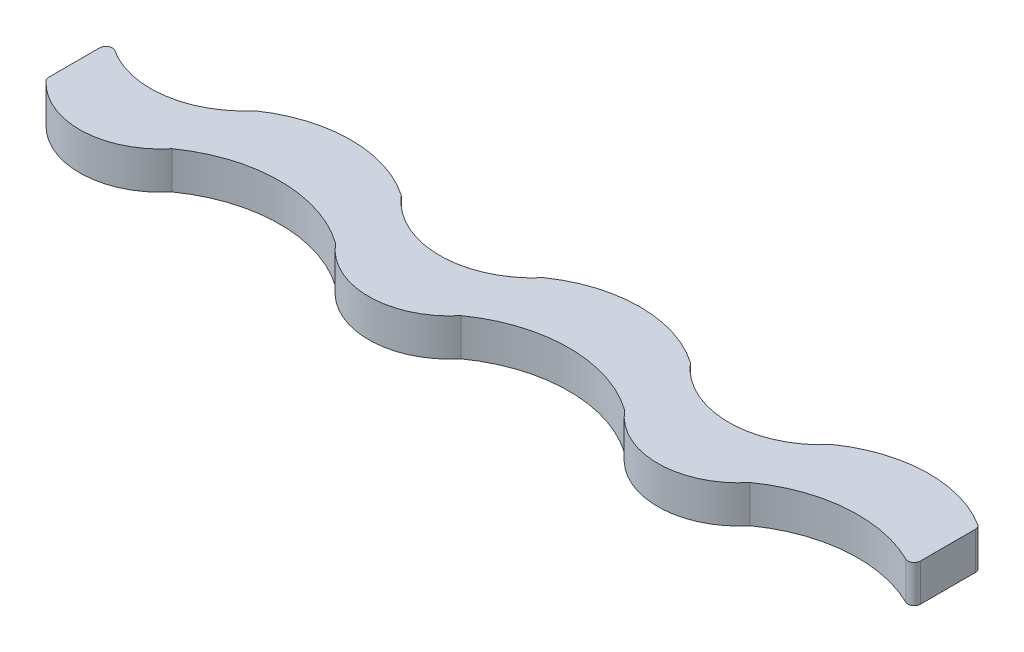
ISO-10303-21;
HEADER;
FILE_DESCRIPTION(('STEP AP214'),'2;1');
FILE_NAME('part.step','',(''),(''),'','','');
FILE_SCHEMA(('AUTOMOTIVE_DESIGN { 1 0 10303 214 1 1 1 1 }'));
ENDSEC;
DATA;
#1=APPLICATION_CONTEXT('core data for automotive mechanical design processes');
#2=APPLICATION_PROTOCOL_DEFINITION('international standard','automotive_design',2000,#1);
#3=PRODUCT_CONTEXT('',#1,'mechanical');
#4=PRODUCT('Part','Part','',(#3));
#5=PRODUCT_RELATED_PRODUCT_CATEGORY('part','',(#4));
#6=PRODUCT_DEFINITION_FORMATION('','',#4);
#7=PRODUCT_DEFINITION_CONTEXT('part definition',#1,'design');
#8=PRODUCT_DEFINITION('design','',#6,#7);
#9=PRODUCT_DEFINITION_SHAPE('','',#8);
#10=(LENGTH_UNIT() NAMED_UNIT(*) SI_UNIT(.MILLI.,.METRE.));
#11=(NAMED_UNIT(*) PLANE_ANGLE_UNIT() SI_UNIT($,.RADIAN.));
#12=(NAMED_UNIT(*) SI_UNIT($,.STERADIAN.) SOLID_ANGLE_UNIT());
#13=UNCERTAINTY_MEASURE_WITH_UNIT(LENGTH_MEASURE(1.E-05),#10,'distance_accuracy_value','');
#14=(GEOMETRIC_REPRESENTATION_CONTEXT(3) GLOBAL_UNCERTAINTY_ASSIGNED_CONTEXT((#13)) GLOBAL_UNIT_ASSIGNED_CONTEXT((#10,
#11,#12)) REPRESENTATION_CONTEXT('',''));
#15=CARTESIAN_POINT('',(0.,0.,0.));
#16=DIRECTION('',(0.,0.,1.));
#17=DIRECTION('',(1.,0.,0.));
#18=AXIS2_PLACEMENT_3D('',#15,#16,#17);
#19=CARTESIAN_POINT('',(0.,0.,0.));
#20=DIRECTION('',(0.,1.,0.));
#21=DIRECTION('',(0.,0.,1.));
#22=AXIS2_PLACEMENT_3D('',#19,#20,#21);
#23=PLANE('',#22);
#24=CARTESIAN_POINT('',(0.,0.,6.68609574402533));
#25=DIRECTION('',(0.,1.,0.));
#26=DIRECTION('',(0.,0.,1.));
#27=AXIS2_PLACEMENT_3D('',#24,#25,#26);
#28=CIRCLE('',#27,6.50000000000014);
#29=CARTESIAN_POINT('',(5.02365097398963,0.,10.8107691724964));
#30=VERTEX_POINT('',#29);
#31=CARTESIAN_POINT('',(-4.72987133287497,0.,11.1446063893473));
#32=VERTEX_POINT('',#31);
#33=EDGE_CURVE('E293',#30,#32,#28,.F.);
#34=ORIENTED_EDGE('',*,*,#33,.T.);
#35=CARTESIAN_POINT('',(-4.36603507649998,0.,10.8016440320148));
#36=DIRECTION('',(0.,1.,0.));
#37=DIRECTION('',(0.,0.,1.));
#38=AXIS2_PLACEMENT_3D('',#35,#36,#37);
#39=CIRCLE('',#38,0.5);
#40=CARTESIAN_POINT('',(-4.86603507649998,0.,10.8016440320148));
#41=VERTEX_POINT('',#40);
#42=EDGE_CURVE('E259',#32,#41,#39,.F.);
#43=ORIENTED_EDGE('',*,*,#42,.T.);
#44=DIRECTION('',(0.,0.,-1.));
#45=VECTOR('',#44,1.);
#46=CARTESIAN_POINT('',(-4.86603507649998,0.,5.70716239774827));
#47=LINE('',#46,#45);
#48=CARTESIAN_POINT('',(-4.86603507649998,0.,6.70356156910438));
#49=VERTEX_POINT('',#48);
#50=EDGE_CURVE('E296',#41,#49,#47,.T.);
#51=ORIENTED_EDGE('',*,*,#50,.T.);
#52=CARTESIAN_POINT('',(-4.36603507649998,0.,6.70356156910438));
#53=DIRECTION('',(0.,1.,0.));
#54=DIRECTION('',(0.,0.,1.));
#55=AXIS2_PLACEMENT_3D('',#52,#53,#54);
#56=CIRCLE('',#55,0.5);
#57=CARTESIAN_POINT('',(-4.09315788421873,0.,6.28458897103536));
#58=VERTEX_POINT('',#57);
#59=EDGE_CURVE('E63',#49,#58,#56,.F.);
#60=ORIENTED_EDGE('',*,*,#59,.T.);
#61=CARTESIAN_POINT('',(0.,0.,0.));
#62=DIRECTION('',(0.,1.,0.));
#63=DIRECTION('',(0.,0.,1.));
#64=AXIS2_PLACEMENT_3D('',#61,#62,#63);
#65=CIRCLE('',#64,7.50000000000009);
#66=CARTESIAN_POINT('',(5.70545400782265,0.,4.86803806113131));
#67=VERTEX_POINT('',#66);
#68=EDGE_CURVE('E298',#58,#67,#65,.T.);
#69=ORIENTED_EDGE('',*,*,#68,.T.);
#70=CARTESIAN_POINT('',(11.575,0.,13.3623923535845));
#71=DIRECTION('',(0.,1.,0.));
#72=DIRECTION('',(0.,0.,1.));
#73=AXIS2_PLACEMENT_3D('',#70,#71,#72);
#74=CIRCLE('',#73,10.3250000000001);
#75=CARTESIAN_POINT('',(17.4445459921774,0.,4.8680380611314));
#76=VERTEX_POINT('',#75);
#77=EDGE_CURVE('E300',#67,#76,#74,.F.);
#78=ORIENTED_EDGE('',*,*,#77,.T.);
#79=CARTESIAN_POINT('',(23.15,0.,0.));
#80=DIRECTION('',(0.,1.,0.));
#81=DIRECTION('',(0.,0.,1.));
#82=AXIS2_PLACEMENT_3D('',#79,#80,#81);
#83=CIRCLE('',#82,7.50000000000017);
#84=CARTESIAN_POINT('',(28.8554540078226,0.,4.8680380611314));
#85=VERTEX_POINT('',#84);
#86=EDGE_CURVE('E303',#76,#85,#83,.T.);
#87=ORIENTED_EDGE('',*,*,#86,.T.);
#88=CARTESIAN_POINT('',(34.725,0.,13.3623923535845));
#89=DIRECTION('',(0.,1.,0.));
#90=DIRECTION('',(0.,0.,1.));
#91=AXIS2_PLACEMENT_3D('',#88,#89,#90);
#92=CIRCLE('',#91,10.3250000000001);
#93=CARTESIAN_POINT('',(40.5945459921774,0.,4.86803806113141));
#94=VERTEX_POINT('',#93);
#95=EDGE_CURVE('E306',#85,#94,#92,.F.);
#96=ORIENTED_EDGE('',*,*,#95,.T.);
#97=CARTESIAN_POINT('',(46.3,0.,0.));
#98=DIRECTION('',(0.,1.,0.));
#99=DIRECTION('',(0.,0.,1.));
#100=AXIS2_PLACEMENT_3D('',#97,#98,#99);
#101=CIRCLE('',#100,7.50000000000017);
#102=CARTESIAN_POINT('',(52.0054540078226,0.,4.86803806113145));
#103=VERTEX_POINT('',#102);
#104=EDGE_CURVE('E309',#94,#103,#101,.T.);
#105=ORIENTED_EDGE('',*,*,#104,.T.);
#106=CARTESIAN_POINT('',(57.875,0.,13.3623923535845));
#107=DIRECTION('',(0.,1.,0.));
#108=DIRECTION('',(0.,0.,1.));
#109=AXIS2_PLACEMENT_3D('',#106,#107,#108);
#110=CIRCLE('',#109,10.3250000000001);
#111=CARTESIAN_POINT('',(63.3490521969606,0.,4.60794333922892));
#112=VERTEX_POINT('',#111);
#113=EDGE_CURVE('E180',#103,#112,#110,.F.);
#114=ORIENTED_EDGE('',*,*,#113,.T.);
#115=CARTESIAN_POINT('',(63.0839649235001,0.,5.03188760142532));
#116=DIRECTION('',(0.,1.,0.));
#117=DIRECTION('',(0.,0.,1.));
#118=AXIS2_PLACEMENT_3D('',#115,#116,#117);
#119=CIRCLE('',#118,0.5);
#120=CARTESIAN_POINT('',(63.5839649235001,0.,5.03188760142532));
#121=VERTEX_POINT('',#120);
#122=EDGE_CURVE('E256',#112,#121,#119,.F.);
#123=ORIENTED_EDGE('',*,*,#122,.T.);
#124=DIRECTION('',(0.,0.,1.));
#125=VECTOR('',#124,1.);
#126=CARTESIAN_POINT('',(63.5839649235001,0.,10.2677240935941));
#127=LINE('',#126,#125);
#128=CARTESIAN_POINT('',(63.5839649235001,0.,9.43258919898844));
#129=VERTEX_POINT('',#128);
#130=EDGE_CURVE('E220',#121,#129,#127,.T.);
#131=ORIENTED_EDGE('',*,*,#130,.T.);
#132=CARTESIAN_POINT('',(63.0839649235001,0.,9.43258919898844));
#133=DIRECTION('',(0.,1.,0.));
#134=DIRECTION('',(0.,0.,1.));
#135=AXIS2_PLACEMENT_3D('',#132,#133,#134);
#136=CIRCLE('',#135,0.5);
#137=CARTESIAN_POINT('',(62.8637127068616,0.,9.88146441668913));
#138=VERTEX_POINT('',#137);
#139=EDGE_CURVE('E254',#129,#138,#136,.F.);
#140=ORIENTED_EDGE('',*,*,#139,.T.);
#141=CARTESIAN_POINT('',(57.8750000000001,0.,20.0484880976097));
#142=DIRECTION('',(0.,1.,0.));
#143=DIRECTION('',(0.,0.,1.));
#144=AXIS2_PLACEMENT_3D('',#141,#142,#143);
#145=CIRCLE('',#144,11.3250000000001);
#146=CARTESIAN_POINT('',(51.3236509739897,0.,10.8107691724965));
#147=VERTEX_POINT('',#146);
#148=EDGE_CURVE('E239',#138,#147,#145,.T.);
#149=ORIENTED_EDGE('',*,*,#148,.T.);
#150=CARTESIAN_POINT('',(46.3000000000001,0.,6.68609574402523));
#151=DIRECTION('',(0.,1.,0.));
#152=DIRECTION('',(0.,0.,1.));
#153=AXIS2_PLACEMENT_3D('',#150,#151,#152);
#154=CIRCLE('',#153,6.50000000000026);
#155=CARTESIAN_POINT('',(41.2763490260104,0.,10.8107691724964));
#156=VERTEX_POINT('',#155);
#157=EDGE_CURVE('E281',#147,#156,#154,.F.);
#158=ORIENTED_EDGE('',*,*,#157,.T.);
#159=CARTESIAN_POINT('',(34.7250000000001,0.,20.0484880976097));
#160=DIRECTION('',(0.,1.,0.));
#161=DIRECTION('',(0.,0.,1.));
#162=AXIS2_PLACEMENT_3D('',#159,#160,#161);
#163=CIRCLE('',#162,11.3250000000001);
#164=CARTESIAN_POINT('',(28.1736509739897,0.,10.8107691724964));
#165=VERTEX_POINT('',#164);
#166=EDGE_CURVE('E284',#156,#165,#163,.T.);
#167=ORIENTED_EDGE('',*,*,#166,.T.);
#168=CARTESIAN_POINT('',(23.1500000000001,0.,6.68609574402525));
#169=DIRECTION('',(0.,1.,0.));
#170=DIRECTION('',(0.,0.,1.));
#171=AXIS2_PLACEMENT_3D('',#168,#169,#170);
#172=CIRCLE('',#171,6.50000000000023);
#173=CARTESIAN_POINT('',(18.1263490260105,0.,10.8107691724964));
#174=VERTEX_POINT('',#173);
#175=EDGE_CURVE('E287',#165,#174,#172,.F.);
#176=ORIENTED_EDGE('',*,*,#175,.T.);
#177=CARTESIAN_POINT('',(11.5750000000001,0.,20.0484880976097));
#178=DIRECTION('',(0.,1.,0.));
#179=DIRECTION('',(0.,0.,1.));
#180=AXIS2_PLACEMENT_3D('',#177,#178,#179);
#181=CIRCLE('',#180,11.3250000000001);
#182=EDGE_CURVE('E290',#174,#30,#181,.T.);
#183=ORIENTED_EDGE('',*,*,#182,.T.);
#184=EDGE_LOOP('',(#34,#43,#51,#60,#69,#78,#87,#96,#105,#114,#123,#131,#140,#149,#158,#167,#176,#183));
#185=FACE_BOUND('',#184,.T.);
#186=ADVANCED_FACE('F41',(#185),#23,.F.);
#187=CARTESIAN_POINT('',(63.5839649235001,-77.2927912107602,10.2677240935941));
#188=DIRECTION('',(1.,0.,0.));
#189=DIRECTION('',(0.,0.,-1.));
#190=AXIS2_PLACEMENT_3D('',#187,#188,#189);
#191=PLANE('',#190);
#192=ORIENTED_EDGE('',*,*,#130,.F.);
#193=DIRECTION('',(0.,1.,0.));
#194=VECTOR('',#193,1.);
#195=CARTESIAN_POINT('',(63.5839649235001,-77.2927912107602,5.03188760142532));
#196=LINE('',#195,#194);
#197=CARTESIAN_POINT('',(63.5839649235001,3.,5.03188760142532));
#198=VERTEX_POINT('',#197);
#199=EDGE_CURVE('E266',#121,#198,#196,.T.);
#200=ORIENTED_EDGE('',*,*,#199,.T.);
#201=DIRECTION('',(0.,0.,-1.));
#202=VECTOR('',#201,1.);
#203=CARTESIAN_POINT('',(63.5839649235001,3.,10.2677240935941));
#204=LINE('',#203,#202);
#205=CARTESIAN_POINT('',(63.5839649235001,3.,9.43258919898844));
#206=VERTEX_POINT('',#205);
#207=EDGE_CURVE('E175',#206,#198,#204,.T.);
#208=ORIENTED_EDGE('',*,*,#207,.F.);
#209=DIRECTION('',(0.,1.,0.));
#210=VECTOR('',#209,1.);
#211=CARTESIAN_POINT('',(63.5839649235001,-77.2927912107602,9.43258919898844));
#212=LINE('',#211,#210);
#213=EDGE_CURVE('E264',#206,#129,#212,.F.);
#214=ORIENTED_EDGE('',*,*,#213,.T.);
#215=EDGE_LOOP('',(#192,#200,#208,#214));
#216=FACE_BOUND('',#215,.T.);
#217=ADVANCED_FACE('F272',(#216),#191,.T.);
#218=CARTESIAN_POINT('',(57.875,-77.2927912107602,13.3623923535845));
#219=DIRECTION('',(0.,1.,0.));
#220=DIRECTION('',(0.,0.,1.));
#221=AXIS2_PLACEMENT_3D('',#218,#219,#220);
#222=CYLINDRICAL_SURFACE('',#221,10.3250000000001);
#223=CARTESIAN_POINT('',(57.875,3.,13.3623923535845));
#224=DIRECTION('',(0.,1.,0.));
#225=DIRECTION('',(0.,0.,1.));
#226=AXIS2_PLACEMENT_3D('',#223,#224,#225);
#227=CIRCLE('',#226,10.3250000000001);
#228=CARTESIAN_POINT('',(63.3490521969606,3.,4.60794333922892));
#229=VERTEX_POINT('',#228);
#230=CARTESIAN_POINT('',(52.0054540078226,3.,4.86803806113145));
#231=VERTEX_POINT('',#230);
#232=EDGE_CURVE('E166',#229,#231,#227,.T.);
#233=ORIENTED_EDGE('',*,*,#232,.F.);
#234=DIRECTION('',(0.,1.,0.));
#235=VECTOR('',#234,1.);
#236=CARTESIAN_POINT('',(63.3490521969606,-77.2927912107602,4.60794333922892));
#237=LINE('',#236,#235);
#238=EDGE_CURVE('E49',#229,#112,#237,.F.);
#239=ORIENTED_EDGE('',*,*,#238,.T.);
#240=ORIENTED_EDGE('',*,*,#113,.F.);
#241=DIRECTION('',(0.,1.,0.));
#242=VECTOR('',#241,1.);
#243=CARTESIAN_POINT('',(52.0054540078226,-77.2927912107602,4.86803806113145));
#244=LINE('',#243,#242);
#245=EDGE_CURVE('E178',#103,#231,#244,.T.);
#246=ORIENTED_EDGE('',*,*,#245,.T.);
#247=EDGE_LOOP('',(#233,#239,#240,#246));
#248=FACE_BOUND('',#247,.T.);
#249=ADVANCED_FACE('F179',(#248),#222,.T.);
#250=CARTESIAN_POINT('',(46.3,-77.2927912107602,0.));
#251=DIRECTION('',(0.,1.,0.));
#252=DIRECTION('',(0.,0.,1.));
#253=AXIS2_PLACEMENT_3D('',#250,#251,#252);
#254=CYLINDRICAL_SURFACE('',#253,7.50000000000017);
#255=DIRECTION('',(0.,1.,0.));
#256=VECTOR('',#255,1.);
#257=CARTESIAN_POINT('',(40.5945459921774,-77.2927912107602,4.8680380611314));
#258=LINE('',#257,#256);
#259=CARTESIAN_POINT('',(40.5945459921774,3.,4.8680380611314));
#260=VERTEX_POINT('',#259);
#261=EDGE_CURVE('E183',#94,#260,#258,.T.);
#262=ORIENTED_EDGE('',*,*,#261,.T.);
#263=CARTESIAN_POINT('',(46.3,3.,0.));
#264=DIRECTION('',(0.,-1.,0.));
#265=DIRECTION('',(0.,0.,1.));
#266=AXIS2_PLACEMENT_3D('',#263,#264,#265);
#267=CIRCLE('',#266,7.50000000000017);
#268=EDGE_CURVE('E172',#231,#260,#267,.T.);
#269=ORIENTED_EDGE('',*,*,#268,.F.);
#270=ORIENTED_EDGE('',*,*,#245,.F.);
#271=ORIENTED_EDGE('',*,*,#104,.F.);
#272=EDGE_LOOP('',(#262,#269,#270,#271));
#273=FACE_BOUND('',#272,.T.);
#274=ADVANCED_FACE('F186',(#273),#254,.F.);
#275=CARTESIAN_POINT('',(34.725,-77.2927912107602,13.3623923535845));
#276=DIRECTION('',(0.,1.,0.));
#277=DIRECTION('',(0.,0.,1.));
#278=AXIS2_PLACEMENT_3D('',#275,#276,#277);
#279=CYLINDRICAL_SURFACE('',#278,10.3250000000001);
#280=DIRECTION('',(0.,1.,0.));
#281=VECTOR('',#280,1.);
#282=CARTESIAN_POINT('',(28.8554540078226,-77.2927912107602,4.86803806113139));
#283=LINE('',#282,#281);
#284=CARTESIAN_POINT('',(28.8554540078226,3.,4.86803806113139));
#285=VERTEX_POINT('',#284);
#286=EDGE_CURVE('E234',#85,#285,#283,.T.);
#287=ORIENTED_EDGE('',*,*,#286,.T.);
#288=CARTESIAN_POINT('',(34.725,3.,13.3623923535845));
#289=DIRECTION('',(0.,1.,0.));
#290=DIRECTION('',(0.,0.,1.));
#291=AXIS2_PLACEMENT_3D('',#288,#289,#290);
#292=CIRCLE('',#291,10.3250000000001);
#293=EDGE_CURVE('E189',#260,#285,#292,.T.);
#294=ORIENTED_EDGE('',*,*,#293,.F.);
#295=ORIENTED_EDGE('',*,*,#261,.F.);
#296=ORIENTED_EDGE('',*,*,#95,.F.);
#297=EDGE_LOOP('',(#287,#294,#295,#296));
#298=FACE_BOUND('',#297,.T.);
#299=ADVANCED_FACE('F361',(#298),#279,.T.);
#300=CARTESIAN_POINT('',(23.15,-77.2927912107602,0.));
#301=DIRECTION('',(0.,1.,0.));
#302=DIRECTION('',(0.,0.,1.));
#303=AXIS2_PLACEMENT_3D('',#300,#301,#302);
#304=CYLINDRICAL_SURFACE('',#303,7.50000000000017);
#305=DIRECTION('',(0.,1.,0.));
#306=VECTOR('',#305,1.);
#307=CARTESIAN_POINT('',(17.4445459921774,-77.2927912107602,4.8680380611314));
#308=LINE('',#307,#306);
#309=CARTESIAN_POINT('',(17.4445459921774,3.,4.8680380611314));
#310=VERTEX_POINT('',#309);
#311=EDGE_CURVE('E232',#76,#310,#308,.T.);
#312=ORIENTED_EDGE('',*,*,#311,.T.);
#313=CARTESIAN_POINT('',(23.15,3.,0.));
#314=DIRECTION('',(0.,-1.,0.));
#315=DIRECTION('',(0.,0.,1.));
#316=AXIS2_PLACEMENT_3D('',#313,#314,#315);
#317=CIRCLE('',#316,7.50000000000017);
#318=EDGE_CURVE('E191',#285,#310,#317,.T.);
#319=ORIENTED_EDGE('',*,*,#318,.F.);
#320=ORIENTED_EDGE('',*,*,#286,.F.);
#321=ORIENTED_EDGE('',*,*,#86,.F.);
#322=EDGE_LOOP('',(#312,#319,#320,#321));
#323=FACE_BOUND('',#322,.T.);
#324=ADVANCED_FACE('F359',(#323),#304,.F.);
#325=CARTESIAN_POINT('',(11.575,-77.2927912107602,13.3623923535845));
#326=DIRECTION('',(0.,1.,0.));
#327=DIRECTION('',(0.,0.,1.));
#328=AXIS2_PLACEMENT_3D('',#325,#326,#327);
#329=CYLINDRICAL_SURFACE('',#328,10.3250000000001);
#330=DIRECTION('',(0.,1.,0.));
#331=VECTOR('',#330,1.);
#332=CARTESIAN_POINT('',(5.70545400782265,-77.2927912107602,4.86803806113131));
#333=LINE('',#332,#331);
#334=CARTESIAN_POINT('',(5.70545400782265,3.,4.86803806113131));
#335=VERTEX_POINT('',#334);
#336=EDGE_CURVE('E230',#67,#335,#333,.T.);
#337=ORIENTED_EDGE('',*,*,#336,.T.);
#338=CARTESIAN_POINT('',(11.575,3.,13.3623923535845));
#339=DIRECTION('',(0.,1.,0.));
#340=DIRECTION('',(0.,0.,1.));
#341=AXIS2_PLACEMENT_3D('',#338,#339,#340);
#342=CIRCLE('',#341,10.3250000000001);
#343=EDGE_CURVE('E197',#310,#335,#342,.T.);
#344=ORIENTED_EDGE('',*,*,#343,.F.);
#345=ORIENTED_EDGE('',*,*,#311,.F.);
#346=ORIENTED_EDGE('',*,*,#77,.F.);
#347=EDGE_LOOP('',(#337,#344,#345,#346));
#348=FACE_BOUND('',#347,.T.);
#349=ADVANCED_FACE('F355',(#348),#329,.T.);
#350=CARTESIAN_POINT('',(0.,-77.2927912107602,0.));
#351=DIRECTION('',(0.,1.,0.));
#352=DIRECTION('',(0.,0.,1.));
#353=AXIS2_PLACEMENT_3D('',#350,#351,#352);
#354=CYLINDRICAL_SURFACE('',#353,7.50000000000009);
#355=ORIENTED_EDGE('',*,*,#68,.F.);
#356=DIRECTION('',(0.,1.,0.));
#357=VECTOR('',#356,1.);
#358=CARTESIAN_POINT('',(-4.09315788421873,-77.2927912107602,6.28458897103536));
#359=LINE('',#358,#357);
#360=CARTESIAN_POINT('',(-4.09315788421873,3.,6.28458897103536));
#361=VERTEX_POINT('',#360);
#362=EDGE_CURVE('E261',#58,#361,#359,.T.);
#363=ORIENTED_EDGE('',*,*,#362,.T.);
#364=CARTESIAN_POINT('',(0.,3.,0.));
#365=DIRECTION('',(0.,-1.,0.));
#366=DIRECTION('',(0.,0.,1.));
#367=AXIS2_PLACEMENT_3D('',#364,#365,#366);
#368=CIRCLE('',#367,7.50000000000009);
#369=EDGE_CURVE('E200',#335,#361,#368,.T.);
#370=ORIENTED_EDGE('',*,*,#369,.F.);
#371=ORIENTED_EDGE('',*,*,#336,.F.);
#372=EDGE_LOOP('',(#355,#363,#370,#371));
#373=FACE_BOUND('',#372,.T.);
#374=ADVANCED_FACE('F349',(#373),#354,.F.);
#375=CARTESIAN_POINT('',(-4.86603507649998,-77.2927912107602,5.70716239774827));
#376=DIRECTION('',(-1.,0.,0.));
#377=DIRECTION('',(0.,0.,1.));
#378=AXIS2_PLACEMENT_3D('',#375,#376,#377);
#379=PLANE('',#378);
#380=ORIENTED_EDGE('',*,*,#50,.F.);
#381=DIRECTION('',(0.,1.,0.));
#382=VECTOR('',#381,1.);
#383=CARTESIAN_POINT('',(-4.86603507649998,-77.2927912107602,10.8016440320148));
#384=LINE('',#383,#382);
#385=CARTESIAN_POINT('',(-4.86603507649998,3.,10.8016440320148));
#386=VERTEX_POINT('',#385);
#387=EDGE_CURVE('E242',#41,#386,#384,.T.);
#388=ORIENTED_EDGE('',*,*,#387,.T.);
#389=DIRECTION('',(0.,0.,1.));
#390=VECTOR('',#389,1.);
#391=CARTESIAN_POINT('',(-4.86603507649998,3.,5.70716239774827));
#392=LINE('',#391,#390);
#393=CARTESIAN_POINT('',(-4.86603507649998,3.,6.70356156910438));
#394=VERTEX_POINT('',#393);
#395=EDGE_CURVE('E203',#394,#386,#392,.T.);
#396=ORIENTED_EDGE('',*,*,#395,.F.);
#397=DIRECTION('',(0.,1.,0.));
#398=VECTOR('',#397,1.);
#399=CARTESIAN_POINT('',(-4.86603507649998,-77.2927912107602,6.70356156910438));
#400=LINE('',#399,#398);
#401=EDGE_CURVE('E240',#394,#49,#400,.F.);
#402=ORIENTED_EDGE('',*,*,#401,.T.);
#403=EDGE_LOOP('',(#380,#388,#396,#402));
#404=FACE_BOUND('',#403,.T.);
#405=ADVANCED_FACE('F343',(#404),#379,.T.);
#406=CARTESIAN_POINT('',(0.,-77.2927912107602,6.68609574402533));
#407=DIRECTION('',(0.,1.,0.));
#408=DIRECTION('',(0.,0.,1.));
#409=AXIS2_PLACEMENT_3D('',#406,#407,#408);
#410=CYLINDRICAL_SURFACE('',#409,6.50000000000014);
#411=CARTESIAN_POINT('',(0.,3.,6.68609574402533));
#412=DIRECTION('',(0.,1.,0.));
#413=DIRECTION('',(0.,0.,1.));
#414=AXIS2_PLACEMENT_3D('',#411,#412,#413);
#415=CIRCLE('',#414,6.50000000000014);
#416=CARTESIAN_POINT('',(-4.72987133287497,3.,11.1446063893473));
#417=VERTEX_POINT('',#416);
#418=CARTESIAN_POINT('',(5.02365097398963,3.,10.8107691724964));
#419=VERTEX_POINT('',#418);
#420=EDGE_CURVE('E205',#417,#419,#415,.T.);
#421=ORIENTED_EDGE('',*,*,#420,.F.);
#422=DIRECTION('',(0.,1.,0.));
#423=VECTOR('',#422,1.);
#424=CARTESIAN_POINT('',(-4.72987133287497,-77.2927912107602,11.1446063893473));
#425=LINE('',#424,#423);
#426=EDGE_CURVE('E252',#417,#32,#425,.F.);
#427=ORIENTED_EDGE('',*,*,#426,.T.);
#428=ORIENTED_EDGE('',*,*,#33,.F.);
#429=DIRECTION('',(0.,1.,0.));
#430=VECTOR('',#429,1.);
#431=CARTESIAN_POINT('',(5.02365097398963,-77.2927912107602,10.8107691724964));
#432=LINE('',#431,#430);
#433=EDGE_CURVE('E227',#30,#419,#432,.T.);
#434=ORIENTED_EDGE('',*,*,#433,.T.);
#435=EDGE_LOOP('',(#421,#427,#428,#434));
#436=FACE_BOUND('',#435,.T.);
#437=ADVANCED_FACE('F403',(#436),#410,.T.);
#438=CARTESIAN_POINT('',(11.5750000000001,-77.2927912107602,20.0484880976097));
#439=DIRECTION('',(0.,1.,0.));
#440=DIRECTION('',(0.,0.,1.));
#441=AXIS2_PLACEMENT_3D('',#438,#439,#440);
#442=CYLINDRICAL_SURFACE('',#441,11.3250000000001);
#443=DIRECTION('',(0.,1.,0.));
#444=VECTOR('',#443,1.);
#445=CARTESIAN_POINT('',(18.1263490260105,-77.2927912107602,10.8107691724964));
#446=LINE('',#445,#444);
#447=CARTESIAN_POINT('',(18.1263490260105,3.,10.8107691724964));
#448=VERTEX_POINT('',#447);
#449=EDGE_CURVE('E225',#174,#448,#446,.T.);
#450=ORIENTED_EDGE('',*,*,#449,.T.);
#451=CARTESIAN_POINT('',(11.5750000000001,3.,20.0484880976097));
#452=DIRECTION('',(0.,-1.,0.));
#453=DIRECTION('',(0.,0.,1.));
#454=AXIS2_PLACEMENT_3D('',#451,#452,#453);
#455=CIRCLE('',#454,11.3250000000001);
#456=EDGE_CURVE('E207',#419,#448,#455,.T.);
#457=ORIENTED_EDGE('',*,*,#456,.F.);
#458=ORIENTED_EDGE('',*,*,#433,.F.);
#459=ORIENTED_EDGE('',*,*,#182,.F.);
#460=EDGE_LOOP('',(#450,#457,#458,#459));
#461=FACE_BOUND('',#460,.T.);
#462=ADVANCED_FACE('F399',(#461),#442,.F.);
#463=CARTESIAN_POINT('',(23.1500000000001,-77.2927912107602,6.68609574402525));
#464=DIRECTION('',(0.,1.,0.));
#465=DIRECTION('',(0.,0.,1.));
#466=AXIS2_PLACEMENT_3D('',#463,#464,#465);
#467=CYLINDRICAL_SURFACE('',#466,6.50000000000023);
#468=DIRECTION('',(0.,1.,0.));
#469=VECTOR('',#468,1.);
#470=CARTESIAN_POINT('',(28.1736509739897,-77.2927912107602,10.8107691724965));
#471=LINE('',#470,#469);
#472=CARTESIAN_POINT('',(28.1736509739897,3.,10.8107691724965));
#473=VERTEX_POINT('',#472);
#474=EDGE_CURVE('E223',#165,#473,#471,.T.);
#475=ORIENTED_EDGE('',*,*,#474,.T.);
#476=CARTESIAN_POINT('',(23.1500000000001,3.,6.68609574402525));
#477=DIRECTION('',(0.,1.,0.));
#478=DIRECTION('',(0.,0.,1.));
#479=AXIS2_PLACEMENT_3D('',#476,#477,#478);
#480=CIRCLE('',#479,6.50000000000023);
#481=EDGE_CURVE('E210',#448,#473,#480,.T.);
#482=ORIENTED_EDGE('',*,*,#481,.F.);
#483=ORIENTED_EDGE('',*,*,#449,.F.);
#484=ORIENTED_EDGE('',*,*,#175,.F.);
#485=EDGE_LOOP('',(#475,#482,#483,#484));
#486=FACE_BOUND('',#485,.T.);
#487=ADVANCED_FACE('F395',(#486),#467,.T.);
#488=CARTESIAN_POINT('',(34.7250000000001,-77.2927912107602,20.0484880976097));
#489=DIRECTION('',(0.,1.,0.));
#490=DIRECTION('',(0.,0.,1.));
#491=AXIS2_PLACEMENT_3D('',#488,#489,#490);
#492=CYLINDRICAL_SURFACE('',#491,11.3250000000001);
#493=DIRECTION('',(0.,1.,0.));
#494=VECTOR('',#493,1.);
#495=CARTESIAN_POINT('',(41.2763490260104,-77.2927912107602,10.8107691724964));
#496=LINE('',#495,#494);
#497=CARTESIAN_POINT('',(41.2763490260104,3.,10.8107691724964));
#498=VERTEX_POINT('',#497);
#499=EDGE_CURVE('E221',#156,#498,#496,.T.);
#500=ORIENTED_EDGE('',*,*,#499,.T.);
#501=CARTESIAN_POINT('',(34.7250000000001,3.,20.0484880976097));
#502=DIRECTION('',(0.,-1.,0.));
#503=DIRECTION('',(0.,0.,1.));
#504=AXIS2_PLACEMENT_3D('',#501,#502,#503);
#505=CIRCLE('',#504,11.3250000000001);
#506=EDGE_CURVE('E213',#473,#498,#505,.T.);
#507=ORIENTED_EDGE('',*,*,#506,.F.);
#508=ORIENTED_EDGE('',*,*,#474,.F.);
#509=ORIENTED_EDGE('',*,*,#166,.F.);
#510=EDGE_LOOP('',(#500,#507,#508,#509));
#511=FACE_BOUND('',#510,.T.);
#512=ADVANCED_FACE('F379',(#511),#492,.F.);
#513=CARTESIAN_POINT('',(46.3000000000001,-77.2927912107602,6.68609574402523));
#514=DIRECTION('',(0.,1.,0.));
#515=DIRECTION('',(0.,0.,1.));
#516=AXIS2_PLACEMENT_3D('',#513,#514,#515);
#517=CYLINDRICAL_SURFACE('',#516,6.50000000000026);
#518=DIRECTION('',(0.,1.,0.));
#519=VECTOR('',#518,1.);
#520=CARTESIAN_POINT('',(51.3236509739896,-77.2927912107602,10.8107691724965));
#521=LINE('',#520,#519);
#522=CARTESIAN_POINT('',(51.3236509739896,3.,10.8107691724965));
#523=VERTEX_POINT('',#522);
#524=EDGE_CURVE('E218',#147,#523,#521,.T.);
#525=ORIENTED_EDGE('',*,*,#524,.T.);
#526=CARTESIAN_POINT('',(46.3000000000001,3.,6.68609574402523));
#527=DIRECTION('',(0.,1.,0.));
#528=DIRECTION('',(0.,0.,1.));
#529=AXIS2_PLACEMENT_3D('',#526,#527,#528);
#530=CIRCLE('',#529,6.50000000000026);
#531=EDGE_CURVE('E184',#498,#523,#530,.T.);
#532=ORIENTED_EDGE('',*,*,#531,.F.);
#533=ORIENTED_EDGE('',*,*,#499,.F.);
#534=ORIENTED_EDGE('',*,*,#157,.F.);
#535=EDGE_LOOP('',(#525,#532,#533,#534));
#536=FACE_BOUND('',#535,.T.);
#537=ADVANCED_FACE('F374',(#536),#517,.T.);
#538=CARTESIAN_POINT('',(57.8750000000001,-77.2927912107602,20.0484880976097));
#539=DIRECTION('',(0.,1.,0.));
#540=DIRECTION('',(0.,0.,1.));
#541=AXIS2_PLACEMENT_3D('',#538,#539,#540);
#542=CYLINDRICAL_SURFACE('',#541,11.3250000000001);
#543=ORIENTED_EDGE('',*,*,#148,.F.);
#544=DIRECTION('',(0.,1.,0.));
#545=VECTOR('',#544,1.);
#546=CARTESIAN_POINT('',(62.8637127068616,-77.2927912107602,9.88146441668913));
#547=LINE('',#546,#545);
#548=CARTESIAN_POINT('',(62.8637127068616,3.,9.88146441668913));
#549=VERTEX_POINT('',#548);
#550=EDGE_CURVE('E11',#138,#549,#547,.T.);
#551=ORIENTED_EDGE('',*,*,#550,.T.);
#552=CARTESIAN_POINT('',(57.8750000000001,3.,20.0484880976097));
#553=DIRECTION('',(0.,-1.,0.));
#554=DIRECTION('',(0.,0.,1.));
#555=AXIS2_PLACEMENT_3D('',#552,#553,#554);
#556=CIRCLE('',#555,11.3250000000001);
#557=EDGE_CURVE('E277',#523,#549,#556,.T.);
#558=ORIENTED_EDGE('',*,*,#557,.F.);
#559=ORIENTED_EDGE('',*,*,#524,.F.);
#560=EDGE_LOOP('',(#543,#551,#558,#559));
#561=FACE_BOUND('',#560,.T.);
#562=ADVANCED_FACE('F337',(#561),#542,.F.);
#563=CARTESIAN_POINT('',(0.,3.,0.));
#564=DIRECTION('',(0.,1.,0.));
#565=DIRECTION('',(0.,0.,1.));
#566=AXIS2_PLACEMENT_3D('',#563,#564,#565);
#567=PLANE('',#566);
#568=ORIENTED_EDGE('',*,*,#395,.T.);
#569=CARTESIAN_POINT('',(-4.36603507649998,3.,10.8016440320148));
#570=DIRECTION('',(0.,1.,0.));
#571=DIRECTION('',(0.,0.,1.));
#572=AXIS2_PLACEMENT_3D('',#569,#570,#571);
#573=CIRCLE('',#572,0.5);
#574=EDGE_CURVE('E250',#386,#417,#573,.T.);
#575=ORIENTED_EDGE('',*,*,#574,.T.);
#576=ORIENTED_EDGE('',*,*,#420,.T.);
#577=ORIENTED_EDGE('',*,*,#456,.T.);
#578=ORIENTED_EDGE('',*,*,#481,.T.);
#579=ORIENTED_EDGE('',*,*,#506,.T.);
#580=ORIENTED_EDGE('',*,*,#531,.T.);
#581=ORIENTED_EDGE('',*,*,#557,.T.);
#582=CARTESIAN_POINT('',(63.0839649235001,3.,9.43258919898844));
#583=DIRECTION('',(0.,1.,0.));
#584=DIRECTION('',(0.,0.,1.));
#585=AXIS2_PLACEMENT_3D('',#582,#583,#584);
#586=CIRCLE('',#585,0.5);
#587=EDGE_CURVE('E245',#549,#206,#586,.T.);
#588=ORIENTED_EDGE('',*,*,#587,.T.);
#589=ORIENTED_EDGE('',*,*,#207,.T.);
#590=CARTESIAN_POINT('',(63.0839649235001,3.,5.03188760142532));
#591=DIRECTION('',(0.,1.,0.));
#592=DIRECTION('',(0.,0.,1.));
#593=AXIS2_PLACEMENT_3D('',#590,#591,#592);
#594=CIRCLE('',#593,0.5);
#595=EDGE_CURVE('E174',#198,#229,#594,.T.);
#596=ORIENTED_EDGE('',*,*,#595,.T.);
#597=ORIENTED_EDGE('',*,*,#232,.T.);
#598=ORIENTED_EDGE('',*,*,#268,.T.);
#599=ORIENTED_EDGE('',*,*,#293,.T.);
#600=ORIENTED_EDGE('',*,*,#318,.T.);
#601=ORIENTED_EDGE('',*,*,#343,.T.);
#602=ORIENTED_EDGE('',*,*,#369,.T.);
#603=CARTESIAN_POINT('',(-4.36603507649998,3.,6.70356156910438));
#604=DIRECTION('',(0.,1.,0.));
#605=DIRECTION('',(0.,0.,1.));
#606=AXIS2_PLACEMENT_3D('',#603,#604,#605);
#607=CIRCLE('',#606,0.5);
#608=EDGE_CURVE('E248',#361,#394,#607,.T.);
#609=ORIENTED_EDGE('',*,*,#608,.T.);
#610=EDGE_LOOP('',(#568,#575,#576,#577,#578,#579,#580,#581,#588,#589,#596,#597,#598,#599,#600,
#601,#602,#609));
#611=FACE_BOUND('',#610,.T.);
#612=ADVANCED_FACE('F169',(#611),#567,.T.);
#613=CARTESIAN_POINT('',(-4.36603507649998,-77.2927912107602,10.8016440320148));
#614=DIRECTION('',(0.,1.,0.));
#615=DIRECTION('',(0.,0.,1.));
#616=AXIS2_PLACEMENT_3D('',#613,#614,#615);
#617=CYLINDRICAL_SURFACE('',#616,0.5);
#618=ORIENTED_EDGE('',*,*,#42,.F.);
#619=ORIENTED_EDGE('',*,*,#426,.F.);
#620=ORIENTED_EDGE('',*,*,#574,.F.);
#621=ORIENTED_EDGE('',*,*,#387,.F.);
#622=EDGE_LOOP('',(#618,#619,#620,#621));
#623=FACE_BOUND('',#622,.T.);
#624=ADVANCED_FACE('F319',(#623),#617,.T.);
#625=CARTESIAN_POINT('',(-4.36603507649998,-77.2927912107602,6.70356156910438));
#626=DIRECTION('',(0.,1.,0.));
#627=DIRECTION('',(0.,0.,1.));
#628=AXIS2_PLACEMENT_3D('',#625,#626,#627);
#629=CYLINDRICAL_SURFACE('',#628,0.5);
#630=ORIENTED_EDGE('',*,*,#59,.F.);
#631=ORIENTED_EDGE('',*,*,#401,.F.);
#632=ORIENTED_EDGE('',*,*,#608,.F.);
#633=ORIENTED_EDGE('',*,*,#362,.F.);
#634=EDGE_LOOP('',(#630,#631,#632,#633));
#635=FACE_BOUND('',#634,.T.);
#636=ADVANCED_FACE('F313',(#635),#629,.T.);
#637=CARTESIAN_POINT('',(63.0839649235001,-77.2927912107602,5.03188760142532));
#638=DIRECTION('',(0.,1.,0.));
#639=DIRECTION('',(0.,0.,1.));
#640=AXIS2_PLACEMENT_3D('',#637,#638,#639);
#641=CYLINDRICAL_SURFACE('',#640,0.5);
#642=ORIENTED_EDGE('',*,*,#122,.F.);
#643=ORIENTED_EDGE('',*,*,#238,.F.);
#644=ORIENTED_EDGE('',*,*,#595,.F.);
#645=ORIENTED_EDGE('',*,*,#199,.F.);
#646=EDGE_LOOP('',(#642,#643,#644,#645));
#647=FACE_BOUND('',#646,.T.);
#648=ADVANCED_FACE('F311',(#647),#641,.T.);
#649=CARTESIAN_POINT('',(63.0839649235001,-77.2927912107602,9.43258919898844));
#650=DIRECTION('',(0.,1.,0.));
#651=DIRECTION('',(0.,0.,1.));
#652=AXIS2_PLACEMENT_3D('',#649,#650,#651);
#653=CYLINDRICAL_SURFACE('',#652,0.5);
#654=ORIENTED_EDGE('',*,*,#139,.F.);
#655=ORIENTED_EDGE('',*,*,#213,.F.);
#656=ORIENTED_EDGE('',*,*,#587,.F.);
#657=ORIENTED_EDGE('',*,*,#550,.F.);
#658=EDGE_LOOP('',(#654,#655,#656,#657));
#659=FACE_BOUND('',#658,.T.);
#660=ADVANCED_FACE('F43',(#659),#653,.T.);
#661=CLOSED_SHELL('',(#186,#217,#249,#274,#299,#324,#349,#374,#405,#437,#462,#487,#512,#537,
#562,#612,#624,#636,#648,#660));
#662=MANIFOLD_SOLID_BREP('B2',#661);
#663=ADVANCED_BREP_SHAPE_REPRESENTATION('',(#18,#662),#14);
#664=SHAPE_DEFINITION_REPRESENTATION(#9,#663);
ENDSEC;
END-ISO-10303-21;
